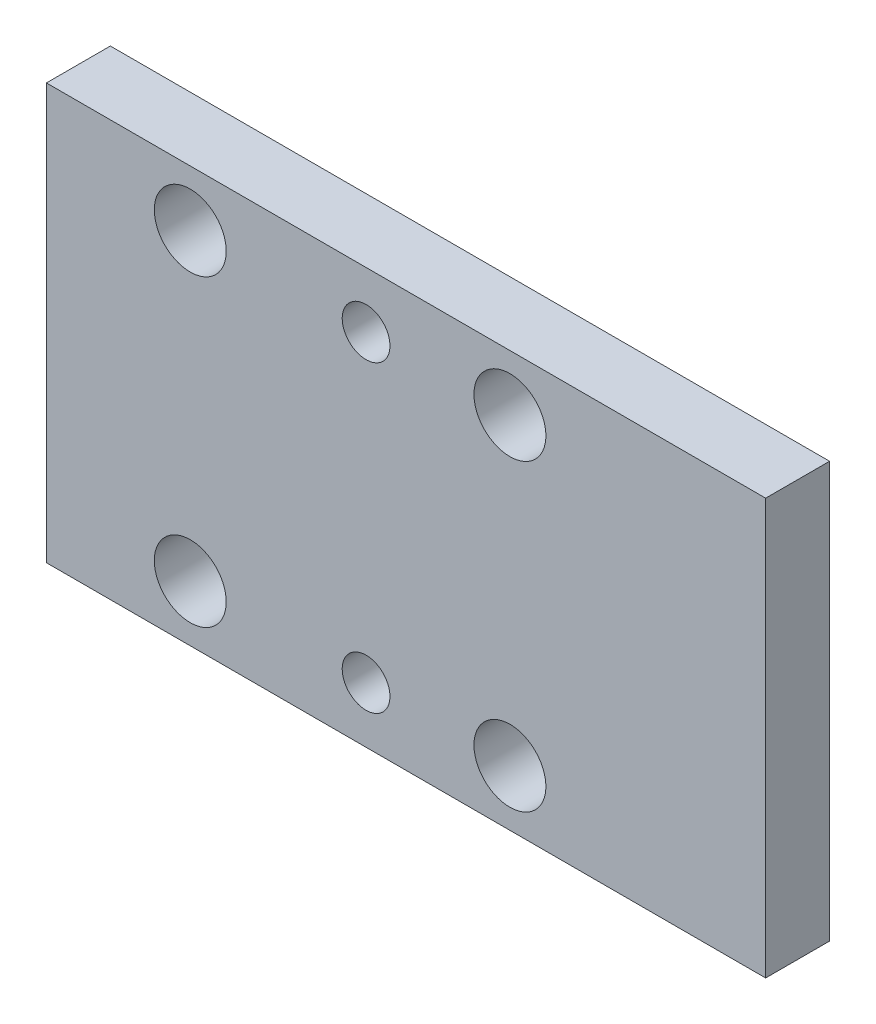
ISO-10303-21;
HEADER;
FILE_DESCRIPTION(('STEP AP214'),'2;1');
FILE_NAME('part.step','',(''),(''),'','','');
FILE_SCHEMA(('AUTOMOTIVE_DESIGN { 1 0 10303 214 1 1 1 1 }'));
ENDSEC;
DATA;
#1=APPLICATION_CONTEXT('core data for automotive mechanical design processes');
#2=APPLICATION_PROTOCOL_DEFINITION('international standard','automotive_design',2000,#1);
#3=PRODUCT_CONTEXT('',#1,'mechanical');
#4=PRODUCT('Part','Part','',(#3));
#5=PRODUCT_RELATED_PRODUCT_CATEGORY('part','',(#4));
#6=PRODUCT_DEFINITION_FORMATION('','',#4);
#7=PRODUCT_DEFINITION_CONTEXT('part definition',#1,'design');
#8=PRODUCT_DEFINITION('design','',#6,#7);
#9=PRODUCT_DEFINITION_SHAPE('','',#8);
#10=(LENGTH_UNIT() NAMED_UNIT(*) SI_UNIT(.MILLI.,.METRE.));
#11=(NAMED_UNIT(*) PLANE_ANGLE_UNIT() SI_UNIT($,.RADIAN.));
#12=(NAMED_UNIT(*) SI_UNIT($,.STERADIAN.) SOLID_ANGLE_UNIT());
#13=UNCERTAINTY_MEASURE_WITH_UNIT(LENGTH_MEASURE(1.E-05),#10,'distance_accuracy_value','');
#14=(GEOMETRIC_REPRESENTATION_CONTEXT(3) GLOBAL_UNCERTAINTY_ASSIGNED_CONTEXT((#13)) GLOBAL_UNIT_ASSIGNED_CONTEXT((#10,
#11,#12)) REPRESENTATION_CONTEXT('',''));
#15=CARTESIAN_POINT('',(0.,0.,0.));
#16=DIRECTION('',(0.,0.,1.));
#17=DIRECTION('',(1.,0.,0.));
#18=AXIS2_PLACEMENT_3D('',#15,#16,#17);
#19=CARTESIAN_POINT('',(-22.5,-13.,4.));
#20=DIRECTION('',(0.,0.,1.));
#21=DIRECTION('',(1.,0.,0.));
#22=AXIS2_PLACEMENT_3D('',#19,#20,#21);
#23=PLANE('',#22);
#24=DIRECTION('',(0.,-1.,0.));
#25=VECTOR('',#24,1.);
#26=CARTESIAN_POINT('',(22.5,13.,4.));
#27=LINE('',#26,#25);
#28=CARTESIAN_POINT('',(22.5,-13.,4.));
#29=VERTEX_POINT('',#28);
#30=CARTESIAN_POINT('',(22.5,13.,4.));
#31=VERTEX_POINT('',#30);
#32=EDGE_CURVE('E54',#29,#31,#27,.F.);
#33=ORIENTED_EDGE('',*,*,#32,.T.);
#34=DIRECTION('',(1.,0.,0.));
#35=VECTOR('',#34,1.);
#36=CARTESIAN_POINT('',(-22.5,13.,4.));
#37=LINE('',#36,#35);
#38=CARTESIAN_POINT('',(-22.5,13.,4.));
#39=VERTEX_POINT('',#38);
#40=EDGE_CURVE('E293',#31,#39,#37,.F.);
#41=ORIENTED_EDGE('',*,*,#40,.T.);
#42=DIRECTION('',(0.,1.,0.));
#43=VECTOR('',#42,1.);
#44=CARTESIAN_POINT('',(-22.5,13.,4.));
#45=LINE('',#44,#43);
#46=CARTESIAN_POINT('',(-22.5,-13.,4.));
#47=VERTEX_POINT('',#46);
#48=EDGE_CURVE('E59',#39,#47,#45,.F.);
#49=ORIENTED_EDGE('',*,*,#48,.T.);
#50=DIRECTION('',(1.,0.,0.));
#51=VECTOR('',#50,1.);
#52=CARTESIAN_POINT('',(-22.5,-13.,4.));
#53=LINE('',#52,#51);
#54=EDGE_CURVE('E57',#47,#29,#53,.T.);
#55=ORIENTED_EDGE('',*,*,#54,.T.);
#56=EDGE_LOOP('',(#33,#41,#49,#55));
#57=FACE_BOUND('',#56,.T.);
#58=CARTESIAN_POINT('',(6.5,-9.5,4.));
#59=DIRECTION('',(0.,0.,-1.));
#60=DIRECTION('',(-1.,0.,0.));
#61=AXIS2_PLACEMENT_3D('',#58,#59,#60);
#62=CIRCLE('',#61,2.25);
#63=CARTESIAN_POINT('',(4.25,-9.5,4.));
#64=VERTEX_POINT('',#63);
#65=EDGE_CURVE('E65',#64,#64,#62,.T.);
#66=ORIENTED_EDGE('',*,*,#65,.T.);
#67=EDGE_LOOP('',(#66));
#68=FACE_BOUND('',#67,.T.);
#69=CARTESIAN_POINT('',(6.5,9.5,4.));
#70=DIRECTION('',(0.,0.,-1.));
#71=DIRECTION('',(-1.,0.,0.));
#72=AXIS2_PLACEMENT_3D('',#69,#70,#71);
#73=CIRCLE('',#72,2.25);
#74=CARTESIAN_POINT('',(4.25,9.5,4.));
#75=VERTEX_POINT('',#74);
#76=EDGE_CURVE('E101',#75,#75,#73,.T.);
#77=ORIENTED_EDGE('',*,*,#76,.T.);
#78=EDGE_LOOP('',(#77));
#79=FACE_BOUND('',#78,.T.);
#80=CARTESIAN_POINT('',(-13.5,9.5,4.));
#81=DIRECTION('',(0.,0.,-1.));
#82=DIRECTION('',(-1.,0.,0.));
#83=AXIS2_PLACEMENT_3D('',#80,#81,#82);
#84=CIRCLE('',#83,2.25);
#85=CARTESIAN_POINT('',(-15.75,9.5,4.));
#86=VERTEX_POINT('',#85);
#87=EDGE_CURVE('E104',#86,#86,#84,.T.);
#88=ORIENTED_EDGE('',*,*,#87,.T.);
#89=EDGE_LOOP('',(#88));
#90=FACE_BOUND('',#89,.T.);
#91=CARTESIAN_POINT('',(-13.5,-9.5,4.));
#92=DIRECTION('',(0.,0.,-1.));
#93=DIRECTION('',(-1.,0.,0.));
#94=AXIS2_PLACEMENT_3D('',#91,#92,#93);
#95=CIRCLE('',#94,2.25);
#96=CARTESIAN_POINT('',(-15.75,-9.5,4.));
#97=VERTEX_POINT('',#96);
#98=EDGE_CURVE('E107',#97,#97,#95,.T.);
#99=ORIENTED_EDGE('',*,*,#98,.T.);
#100=EDGE_LOOP('',(#99));
#101=FACE_BOUND('',#100,.T.);
#102=CARTESIAN_POINT('',(-2.5,9.5,4.));
#103=DIRECTION('',(0.,0.,-1.));
#104=DIRECTION('',(-1.,0.,0.));
#105=AXIS2_PLACEMENT_3D('',#102,#103,#104);
#106=CIRCLE('',#105,1.49499999999999);
#107=CARTESIAN_POINT('',(-3.995,9.5,4.));
#108=VERTEX_POINT('',#107);
#109=EDGE_CURVE('E109',#108,#108,#106,.T.);
#110=ORIENTED_EDGE('',*,*,#109,.T.);
#111=EDGE_LOOP('',(#110));
#112=FACE_BOUND('',#111,.T.);
#113=CARTESIAN_POINT('',(-2.5,-9.5,4.));
#114=DIRECTION('',(0.,0.,-1.));
#115=DIRECTION('',(-1.,0.,0.));
#116=AXIS2_PLACEMENT_3D('',#113,#114,#115);
#117=CIRCLE('',#116,1.49499999999999);
#118=CARTESIAN_POINT('',(-3.995,-9.5,4.));
#119=VERTEX_POINT('',#118);
#120=EDGE_CURVE('E19',#119,#119,#117,.T.);
#121=ORIENTED_EDGE('',*,*,#120,.T.);
#122=EDGE_LOOP('',(#121));
#123=FACE_BOUND('',#122,.T.);
#124=ADVANCED_FACE('F16',(#57,#68,#79,#90,#101,#112,#123),#23,.T.);
#125=CARTESIAN_POINT('',(-2.5,-9.5,0.));
#126=DIRECTION('',(0.,0.,-1.));
#127=DIRECTION('',(-1.,0.,0.));
#128=AXIS2_PLACEMENT_3D('',#125,#126,#127);
#129=CYLINDRICAL_SURFACE('',#128,1.49499999999999);
#130=ORIENTED_EDGE('',*,*,#120,.F.);
#131=EDGE_LOOP('',(#130));
#132=FACE_BOUND('',#131,.T.);
#133=CARTESIAN_POINT('',(-2.5,-9.5,0.));
#134=DIRECTION('',(0.,0.,-1.));
#135=DIRECTION('',(-1.,0.,0.));
#136=AXIS2_PLACEMENT_3D('',#133,#134,#135);
#137=CIRCLE('',#136,1.49499999999999);
#138=CARTESIAN_POINT('',(-3.995,-9.5,0.));
#139=VERTEX_POINT('',#138);
#140=EDGE_CURVE('E95',#139,#139,#137,.T.);
#141=ORIENTED_EDGE('',*,*,#140,.T.);
#142=EDGE_LOOP('',(#141));
#143=FACE_BOUND('',#142,.T.);
#144=ADVANCED_FACE('F117',(#132,#143),#129,.F.);
#145=CARTESIAN_POINT('',(-2.5,9.5,0.));
#146=DIRECTION('',(0.,0.,-1.));
#147=DIRECTION('',(-1.,0.,0.));
#148=AXIS2_PLACEMENT_3D('',#145,#146,#147);
#149=CYLINDRICAL_SURFACE('',#148,1.49499999999999);
#150=ORIENTED_EDGE('',*,*,#109,.F.);
#151=EDGE_LOOP('',(#150));
#152=FACE_BOUND('',#151,.T.);
#153=CARTESIAN_POINT('',(-2.5,9.5,0.));
#154=DIRECTION('',(0.,0.,-1.));
#155=DIRECTION('',(-1.,0.,0.));
#156=AXIS2_PLACEMENT_3D('',#153,#154,#155);
#157=CIRCLE('',#156,1.49499999999999);
#158=CARTESIAN_POINT('',(-3.995,9.5,0.));
#159=VERTEX_POINT('',#158);
#160=EDGE_CURVE('E92',#159,#159,#157,.T.);
#161=ORIENTED_EDGE('',*,*,#160,.T.);
#162=EDGE_LOOP('',(#161));
#163=FACE_BOUND('',#162,.T.);
#164=ADVANCED_FACE('F120',(#152,#163),#149,.F.);
#165=CARTESIAN_POINT('',(-13.5,-9.5,0.));
#166=DIRECTION('',(0.,0.,-1.));
#167=DIRECTION('',(-1.,0.,0.));
#168=AXIS2_PLACEMENT_3D('',#165,#166,#167);
#169=CYLINDRICAL_SURFACE('',#168,2.25);
#170=ORIENTED_EDGE('',*,*,#98,.F.);
#171=EDGE_LOOP('',(#170));
#172=FACE_BOUND('',#171,.T.);
#173=CARTESIAN_POINT('',(-13.5,-9.5,0.));
#174=DIRECTION('',(0.,0.,-1.));
#175=DIRECTION('',(-1.,0.,0.));
#176=AXIS2_PLACEMENT_3D('',#173,#174,#175);
#177=CIRCLE('',#176,2.25);
#178=CARTESIAN_POINT('',(-15.75,-9.5,0.));
#179=VERTEX_POINT('',#178);
#180=EDGE_CURVE('E89',#179,#179,#177,.T.);
#181=ORIENTED_EDGE('',*,*,#180,.T.);
#182=EDGE_LOOP('',(#181));
#183=FACE_BOUND('',#182,.T.);
#184=ADVANCED_FACE('F155',(#172,#183),#169,.F.);
#185=CARTESIAN_POINT('',(-13.5,9.5,0.));
#186=DIRECTION('',(0.,0.,-1.));
#187=DIRECTION('',(-1.,0.,0.));
#188=AXIS2_PLACEMENT_3D('',#185,#186,#187);
#189=CYLINDRICAL_SURFACE('',#188,2.25);
#190=ORIENTED_EDGE('',*,*,#87,.F.);
#191=EDGE_LOOP('',(#190));
#192=FACE_BOUND('',#191,.T.);
#193=CARTESIAN_POINT('',(-13.5,9.5,0.));
#194=DIRECTION('',(0.,0.,-1.));
#195=DIRECTION('',(-1.,0.,0.));
#196=AXIS2_PLACEMENT_3D('',#193,#194,#195);
#197=CIRCLE('',#196,2.25);
#198=CARTESIAN_POINT('',(-15.75,9.5,0.));
#199=VERTEX_POINT('',#198);
#200=EDGE_CURVE('E86',#199,#199,#197,.T.);
#201=ORIENTED_EDGE('',*,*,#200,.T.);
#202=EDGE_LOOP('',(#201));
#203=FACE_BOUND('',#202,.T.);
#204=ADVANCED_FACE('F151',(#192,#203),#189,.F.);
#205=CARTESIAN_POINT('',(6.5,9.5,0.));
#206=DIRECTION('',(0.,0.,-1.));
#207=DIRECTION('',(-1.,0.,0.));
#208=AXIS2_PLACEMENT_3D('',#205,#206,#207);
#209=CYLINDRICAL_SURFACE('',#208,2.25);
#210=ORIENTED_EDGE('',*,*,#76,.F.);
#211=EDGE_LOOP('',(#210));
#212=FACE_BOUND('',#211,.T.);
#213=CARTESIAN_POINT('',(6.5,9.5,0.));
#214=DIRECTION('',(0.,0.,-1.));
#215=DIRECTION('',(-1.,0.,0.));
#216=AXIS2_PLACEMENT_3D('',#213,#214,#215);
#217=CIRCLE('',#216,2.25);
#218=CARTESIAN_POINT('',(4.25,9.5,0.));
#219=VERTEX_POINT('',#218);
#220=EDGE_CURVE('E83',#219,#219,#217,.T.);
#221=ORIENTED_EDGE('',*,*,#220,.T.);
#222=EDGE_LOOP('',(#221));
#223=FACE_BOUND('',#222,.T.);
#224=ADVANCED_FACE('F147',(#212,#223),#209,.F.);
#225=CARTESIAN_POINT('',(6.5,-9.5,0.));
#226=DIRECTION('',(0.,0.,-1.));
#227=DIRECTION('',(-1.,0.,0.));
#228=AXIS2_PLACEMENT_3D('',#225,#226,#227);
#229=CYLINDRICAL_SURFACE('',#228,2.25);
#230=ORIENTED_EDGE('',*,*,#65,.F.);
#231=EDGE_LOOP('',(#230));
#232=FACE_BOUND('',#231,.T.);
#233=CARTESIAN_POINT('',(6.5,-9.5,0.));
#234=DIRECTION('',(0.,0.,-1.));
#235=DIRECTION('',(-1.,0.,0.));
#236=AXIS2_PLACEMENT_3D('',#233,#234,#235);
#237=CIRCLE('',#236,2.25);
#238=CARTESIAN_POINT('',(4.25,-9.5,0.));
#239=VERTEX_POINT('',#238);
#240=EDGE_CURVE('E80',#239,#239,#237,.T.);
#241=ORIENTED_EDGE('',*,*,#240,.T.);
#242=EDGE_LOOP('',(#241));
#243=FACE_BOUND('',#242,.T.);
#244=ADVANCED_FACE('F144',(#232,#243),#229,.F.);
#245=CARTESIAN_POINT('',(-22.5,-13.,4.));
#246=DIRECTION('',(0.,1.,0.));
#247=DIRECTION('',(0.,0.,1.));
#248=AXIS2_PLACEMENT_3D('',#245,#246,#247);
#249=PLANE('',#248);
#250=DIRECTION('',(0.,0.,1.));
#251=VECTOR('',#250,1.);
#252=CARTESIAN_POINT('',(22.5,-13.,4.));
#253=LINE('',#252,#251);
#254=CARTESIAN_POINT('',(22.5,-13.,0.));
#255=VERTEX_POINT('',#254);
#256=EDGE_CURVE('E64',#255,#29,#253,.T.);
#257=ORIENTED_EDGE('',*,*,#256,.T.);
#258=ORIENTED_EDGE('',*,*,#54,.F.);
#259=DIRECTION('',(0.,0.,1.));
#260=VECTOR('',#259,1.);
#261=CARTESIAN_POINT('',(-22.5,-13.,4.));
#262=LINE('',#261,#260);
#263=CARTESIAN_POINT('',(-22.5,-13.,0.));
#264=VERTEX_POINT('',#263);
#265=EDGE_CURVE('E98',#47,#264,#262,.F.);
#266=ORIENTED_EDGE('',*,*,#265,.T.);
#267=DIRECTION('',(1.,0.,0.));
#268=VECTOR('',#267,1.);
#269=CARTESIAN_POINT('',(-22.5,-13.,0.));
#270=LINE('',#269,#268);
#271=EDGE_CURVE('E76',#264,#255,#270,.T.);
#272=ORIENTED_EDGE('',*,*,#271,.T.);
#273=EDGE_LOOP('',(#257,#258,#266,#272));
#274=FACE_BOUND('',#273,.T.);
#275=ADVANCED_FACE('F75',(#274),#249,.F.);
#276=CARTESIAN_POINT('',(22.5,13.,4.));
#277=DIRECTION('',(-1.,0.,0.));
#278=DIRECTION('',(0.,-1.,0.));
#279=AXIS2_PLACEMENT_3D('',#276,#277,#278);
#280=PLANE('',#279);
#281=DIRECTION('',(0.,0.,-1.));
#282=VECTOR('',#281,1.);
#283=CARTESIAN_POINT('',(22.5,13.,4.));
#284=LINE('',#283,#282);
#285=CARTESIAN_POINT('',(22.5,13.,0.));
#286=VERTEX_POINT('',#285);
#287=EDGE_CURVE('E72',#286,#31,#284,.F.);
#288=ORIENTED_EDGE('',*,*,#287,.T.);
#289=ORIENTED_EDGE('',*,*,#32,.F.);
#290=ORIENTED_EDGE('',*,*,#256,.F.);
#291=DIRECTION('',(0.,1.,0.));
#292=VECTOR('',#291,1.);
#293=CARTESIAN_POINT('',(22.5,-13.,0.));
#294=LINE('',#293,#292);
#295=EDGE_CURVE('E300',#255,#286,#294,.T.);
#296=ORIENTED_EDGE('',*,*,#295,.T.);
#297=EDGE_LOOP('',(#288,#289,#290,#296));
#298=FACE_BOUND('',#297,.T.);
#299=ADVANCED_FACE('F69',(#298),#280,.F.);
#300=CARTESIAN_POINT('',(-22.5,13.,4.));
#301=DIRECTION('',(0.,-1.,0.));
#302=DIRECTION('',(0.,0.,-1.));
#303=AXIS2_PLACEMENT_3D('',#300,#301,#302);
#304=PLANE('',#303);
#305=DIRECTION('',(0.,0.,1.));
#306=VECTOR('',#305,1.);
#307=CARTESIAN_POINT('',(-22.5,13.,4.));
#308=LINE('',#307,#306);
#309=CARTESIAN_POINT('',(-22.5,13.,0.));
#310=VERTEX_POINT('',#309);
#311=EDGE_CURVE('E33',#310,#39,#308,.T.);
#312=ORIENTED_EDGE('',*,*,#311,.T.);
#313=ORIENTED_EDGE('',*,*,#40,.F.);
#314=ORIENTED_EDGE('',*,*,#287,.F.);
#315=DIRECTION('',(1.,0.,0.));
#316=VECTOR('',#315,1.);
#317=CARTESIAN_POINT('',(-22.5,13.,0.));
#318=LINE('',#317,#316);
#319=EDGE_CURVE('E25',#286,#310,#318,.F.);
#320=ORIENTED_EDGE('',*,*,#319,.T.);
#321=EDGE_LOOP('',(#312,#313,#314,#320));
#322=FACE_BOUND('',#321,.T.);
#323=ADVANCED_FACE('F132',(#322),#304,.F.);
#324=CARTESIAN_POINT('',(-22.5,13.,4.));
#325=DIRECTION('',(1.,0.,0.));
#326=DIRECTION('',(0.,1.,0.));
#327=AXIS2_PLACEMENT_3D('',#324,#325,#326);
#328=PLANE('',#327);
#329=ORIENTED_EDGE('',*,*,#265,.F.);
#330=ORIENTED_EDGE('',*,*,#48,.F.);
#331=ORIENTED_EDGE('',*,*,#311,.F.);
#332=DIRECTION('',(0.,1.,0.));
#333=VECTOR('',#332,1.);
#334=CARTESIAN_POINT('',(-22.5,-13.,0.));
#335=LINE('',#334,#333);
#336=EDGE_CURVE('E11',#310,#264,#335,.F.);
#337=ORIENTED_EDGE('',*,*,#336,.T.);
#338=EDGE_LOOP('',(#329,#330,#331,#337));
#339=FACE_BOUND('',#338,.T.);
#340=ADVANCED_FACE('F125',(#339),#328,.F.);
#341=CARTESIAN_POINT('',(-22.5,-13.,0.));
#342=DIRECTION('',(0.,0.,1.));
#343=DIRECTION('',(1.,0.,0.));
#344=AXIS2_PLACEMENT_3D('',#341,#342,#343);
#345=PLANE('',#344);
#346=ORIENTED_EDGE('',*,*,#319,.F.);
#347=ORIENTED_EDGE('',*,*,#295,.F.);
#348=ORIENTED_EDGE('',*,*,#271,.F.);
#349=ORIENTED_EDGE('',*,*,#336,.F.);
#350=EDGE_LOOP('',(#346,#347,#348,#349));
#351=FACE_BOUND('',#350,.T.);
#352=ORIENTED_EDGE('',*,*,#240,.F.);
#353=EDGE_LOOP('',(#352));
#354=FACE_BOUND('',#353,.T.);
#355=ORIENTED_EDGE('',*,*,#220,.F.);
#356=EDGE_LOOP('',(#355));
#357=FACE_BOUND('',#356,.T.);
#358=ORIENTED_EDGE('',*,*,#200,.F.);
#359=EDGE_LOOP('',(#358));
#360=FACE_BOUND('',#359,.T.);
#361=ORIENTED_EDGE('',*,*,#180,.F.);
#362=EDGE_LOOP('',(#361));
#363=FACE_BOUND('',#362,.T.);
#364=ORIENTED_EDGE('',*,*,#160,.F.);
#365=EDGE_LOOP('',(#364));
#366=FACE_BOUND('',#365,.T.);
#367=ORIENTED_EDGE('',*,*,#140,.F.);
#368=EDGE_LOOP('',(#367));
#369=FACE_BOUND('',#368,.T.);
#370=ADVANCED_FACE('F123',(#351,#354,#357,#360,#363,#366,#369),#345,.F.);
#371=CLOSED_SHELL('',(#124,#144,#164,#184,#204,#224,#244,#275,#299,#323,#340,#370));
#372=MANIFOLD_SOLID_BREP('B1',#371);
#373=ADVANCED_BREP_SHAPE_REPRESENTATION('',(#18,#372),#14);
#374=SHAPE_DEFINITION_REPRESENTATION(#9,#373);
ENDSEC;
END-ISO-10303-21;
